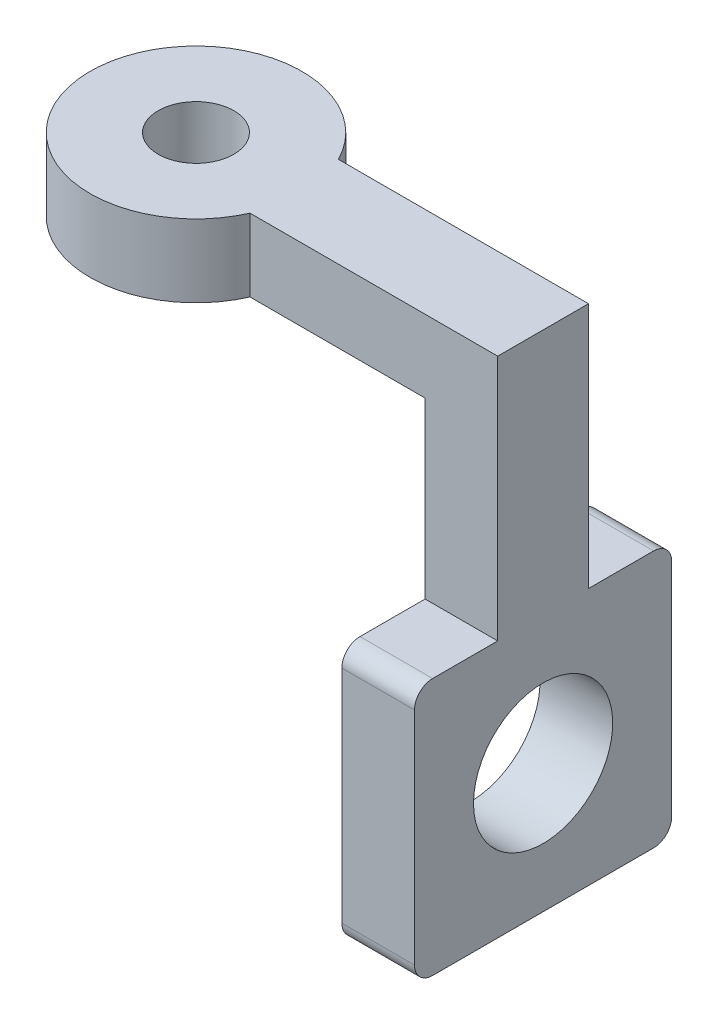
ISO-10303-21;
HEADER;
FILE_DESCRIPTION(('STEP AP214'),'2;1');
FILE_NAME('part.step','',(''),(''),'','','');
FILE_SCHEMA(('AUTOMOTIVE_DESIGN { 1 0 10303 214 1 1 1 1 }'));
ENDSEC;
DATA;
#1=APPLICATION_CONTEXT('core data for automotive mechanical design processes');
#2=APPLICATION_PROTOCOL_DEFINITION('international standard','automotive_design',2000,#1);
#3=PRODUCT_CONTEXT('',#1,'mechanical');
#4=PRODUCT('Part','Part','',(#3));
#5=PRODUCT_RELATED_PRODUCT_CATEGORY('part','',(#4));
#6=PRODUCT_DEFINITION_FORMATION('','',#4);
#7=PRODUCT_DEFINITION_CONTEXT('part definition',#1,'design');
#8=PRODUCT_DEFINITION('design','',#6,#7);
#9=PRODUCT_DEFINITION_SHAPE('','',#8);
#10=(LENGTH_UNIT() NAMED_UNIT(*) SI_UNIT(.MILLI.,.METRE.));
#11=(NAMED_UNIT(*) PLANE_ANGLE_UNIT() SI_UNIT($,.RADIAN.));
#12=(NAMED_UNIT(*) SI_UNIT($,.STERADIAN.) SOLID_ANGLE_UNIT());
#13=UNCERTAINTY_MEASURE_WITH_UNIT(LENGTH_MEASURE(1.E-05),#10,'distance_accuracy_value','');
#14=(GEOMETRIC_REPRESENTATION_CONTEXT(3) GLOBAL_UNCERTAINTY_ASSIGNED_CONTEXT((#13)) GLOBAL_UNIT_ASSIGNED_CONTEXT((#10,
#11,#12)) REPRESENTATION_CONTEXT('',''));
#15=CARTESIAN_POINT('',(0.,0.,0.));
#16=DIRECTION('',(0.,0.,1.));
#17=DIRECTION('',(1.,0.,0.));
#18=AXIS2_PLACEMENT_3D('',#15,#16,#17);
#19=CARTESIAN_POINT('',(-1.15344042768471,49.9375,15.));
#20=DIRECTION('',(0.,0.,1.));
#21=DIRECTION('',(1.,0.,0.));
#22=AXIS2_PLACEMENT_3D('',#19,#20,#21);
#23=PLANE('',#22);
#24=DIRECTION('',(0.,1.,0.));
#25=VECTOR('',#24,1.);
#26=CARTESIAN_POINT('',(-13.1534404276847,-33.3125,15.));
#27=LINE('',#26,#25);
#28=CARTESIAN_POINT('',(-13.1534404276847,9.1875,15.));
#29=VERTEX_POINT('',#28);
#30=CARTESIAN_POINT('',(-13.1534404276847,37.9375,15.));
#31=VERTEX_POINT('',#30);
#32=EDGE_CURVE('E151',#29,#31,#27,.T.);
#33=ORIENTED_EDGE('',*,*,#32,.F.);
#34=DIRECTION('',(-1.,0.,0.));
#35=VECTOR('',#34,1.);
#36=CARTESIAN_POINT('',(-13.1534404276847,9.1875,15.));
#37=LINE('',#36,#35);
#38=CARTESIAN_POINT('',(-1.1534404276847,9.1875,15.));
#39=VERTEX_POINT('',#38);
#40=EDGE_CURVE('E137',#39,#29,#37,.T.);
#41=ORIENTED_EDGE('',*,*,#40,.F.);
#42=DIRECTION('',(0.,-1.,0.));
#43=VECTOR('',#42,1.);
#44=CARTESIAN_POINT('',(-1.15344042768471,49.9375,15.));
#45=LINE('',#44,#43);
#46=CARTESIAN_POINT('',(-1.15344042768471,49.9375,15.));
#47=VERTEX_POINT('',#46);
#48=EDGE_CURVE('E148',#47,#39,#45,.T.);
#49=ORIENTED_EDGE('',*,*,#48,.F.);
#50=DIRECTION('',(-1.,0.,0.));
#51=VECTOR('',#50,1.);
#52=CARTESIAN_POINT('',(-1.15344042768471,49.9375,15.));
#53=LINE('',#52,#51);
#54=CARTESIAN_POINT('',(-42.0763383088604,49.9375,15.));
#55=VERTEX_POINT('',#54);
#56=EDGE_CURVE('E248',#47,#55,#53,.T.);
#57=ORIENTED_EDGE('',*,*,#56,.T.);
#58=DIRECTION('',(0.,-1.,0.));
#59=VECTOR('',#58,1.);
#60=CARTESIAN_POINT('',(-42.0763383088604,49.9375,15.));
#61=LINE('',#60,#59);
#62=CARTESIAN_POINT('',(-42.0763383088604,37.9375,15.));
#63=VERTEX_POINT('',#62);
#64=EDGE_CURVE('E159',#55,#63,#61,.T.);
#65=ORIENTED_EDGE('',*,*,#64,.T.);
#66=DIRECTION('',(-1.,0.,0.));
#67=VECTOR('',#66,1.);
#68=CARTESIAN_POINT('',(-1.15344042768471,37.9375,15.));
#69=LINE('',#68,#67);
#70=EDGE_CURVE('E246',#31,#63,#69,.T.);
#71=ORIENTED_EDGE('',*,*,#70,.F.);
#72=EDGE_LOOP('',(#33,#41,#49,#57,#65,#71));
#73=FACE_BOUND('',#72,.T.);
#74=ADVANCED_FACE('F33',(#73),#23,.T.);
#75=CARTESIAN_POINT('',(-42.4752725396709,49.9375,0.));
#76=DIRECTION('',(0.,0.,-1.));
#77=DIRECTION('',(-1.,0.,0.));
#78=AXIS2_PLACEMENT_3D('',#75,#76,#77);
#79=PLANE('',#78);
#80=DIRECTION('',(0.,-1.,0.));
#81=VECTOR('',#80,1.);
#82=CARTESIAN_POINT('',(-1.15344042768471,49.9375,0.));
#83=LINE('',#82,#81);
#84=CARTESIAN_POINT('',(-1.15344042768471,49.9375,0.));
#85=VERTEX_POINT('',#84);
#86=CARTESIAN_POINT('',(-1.1534404276847,9.1875,0.));
#87=VERTEX_POINT('',#86);
#88=EDGE_CURVE('E179',#85,#87,#83,.T.);
#89=ORIENTED_EDGE('',*,*,#88,.T.);
#90=DIRECTION('',(1.,0.,0.));
#91=VECTOR('',#90,1.);
#92=CARTESIAN_POINT('',(-1.1534404276847,9.1875,0.));
#93=LINE('',#92,#91);
#94=CARTESIAN_POINT('',(-13.1534404276847,9.1875,0.));
#95=VERTEX_POINT('',#94);
#96=EDGE_CURVE('E143',#95,#87,#93,.T.);
#97=ORIENTED_EDGE('',*,*,#96,.F.);
#98=DIRECTION('',(0.,1.,0.));
#99=VECTOR('',#98,1.);
#100=CARTESIAN_POINT('',(-13.1534404276847,-33.3125,0.));
#101=LINE('',#100,#99);
#102=CARTESIAN_POINT('',(-13.1534404276847,37.9375,0.));
#103=VERTEX_POINT('',#102);
#104=EDGE_CURVE('E241',#95,#103,#101,.T.);
#105=ORIENTED_EDGE('',*,*,#104,.T.);
#106=DIRECTION('',(1.,0.,0.));
#107=VECTOR('',#106,1.);
#108=CARTESIAN_POINT('',(-42.4752725396709,37.9375,0.));
#109=LINE('',#108,#107);
#110=CARTESIAN_POINT('',(-42.4752725396708,37.9375,0.));
#111=VERTEX_POINT('',#110);
#112=EDGE_CURVE('E249',#111,#103,#109,.T.);
#113=ORIENTED_EDGE('',*,*,#112,.F.);
#114=DIRECTION('',(0.,-1.,0.));
#115=VECTOR('',#114,1.);
#116=CARTESIAN_POINT('',(-42.4752725396708,49.9375,0.));
#117=LINE('',#116,#115);
#118=CARTESIAN_POINT('',(-42.4752725396708,49.9375,0.));
#119=VERTEX_POINT('',#118);
#120=EDGE_CURVE('E163',#119,#111,#117,.T.);
#121=ORIENTED_EDGE('',*,*,#120,.F.);
#122=DIRECTION('',(1.,0.,0.));
#123=VECTOR('',#122,1.);
#124=CARTESIAN_POINT('',(-42.4752725396709,49.9375,0.));
#125=LINE('',#124,#123);
#126=EDGE_CURVE('E160',#119,#85,#125,.T.);
#127=ORIENTED_EDGE('',*,*,#126,.T.);
#128=EDGE_LOOP('',(#89,#97,#105,#113,#121,#127));
#129=FACE_BOUND('',#128,.T.);
#130=ADVANCED_FACE('F270',(#129),#79,.T.);
#131=CARTESIAN_POINT('',(-1.15344042768471,49.9375,0.));
#132=DIRECTION('',(1.,0.,0.));
#133=DIRECTION('',(0.,0.,-1.));
#134=AXIS2_PLACEMENT_3D('',#131,#132,#133);
#135=PLANE('',#134);
#136=CARTESIAN_POINT('',(-1.15344042768469,-12.0625,7.5));
#137=DIRECTION('',(-1.,0.,0.));
#138=DIRECTION('',(0.,0.,1.));
#139=AXIS2_PLACEMENT_3D('',#136,#137,#138);
#140=CIRCLE('',#139,11.5);
#141=CARTESIAN_POINT('',(-1.15344042768469,-12.0625,19.));
#142=VERTEX_POINT('',#141);
#143=EDGE_CURVE('E153',#142,#142,#140,.T.);
#144=ORIENTED_EDGE('',*,*,#143,.T.);
#145=EDGE_LOOP('',(#144));
#146=FACE_BOUND('',#145,.T.);
#147=DIRECTION('',(0.,0.,-1.));
#148=VECTOR('',#147,1.);
#149=CARTESIAN_POINT('',(-1.1534404276847,9.1875,28.75));
#150=LINE('',#149,#148);
#151=CARTESIAN_POINT('',(-1.1534404276847,9.1875,25.75));
#152=VERTEX_POINT('',#151);
#153=EDGE_CURVE('E133',#152,#39,#150,.T.);
#154=ORIENTED_EDGE('',*,*,#153,.F.);
#155=CARTESIAN_POINT('',(-1.15344042768471,6.1875,25.75));
#156=DIRECTION('',(1.,0.,0.));
#157=DIRECTION('',(0.,0.,-1.));
#158=AXIS2_PLACEMENT_3D('',#155,#156,#157);
#159=CIRCLE('',#158,3.);
#160=CARTESIAN_POINT('',(-1.1534404276847,6.1875,28.75));
#161=VERTEX_POINT('',#160);
#162=EDGE_CURVE('E195',#152,#161,#159,.T.);
#163=ORIENTED_EDGE('',*,*,#162,.T.);
#164=DIRECTION('',(0.,1.,0.));
#165=VECTOR('',#164,1.);
#166=CARTESIAN_POINT('',(-1.1534404276847,9.1875,28.75));
#167=LINE('',#166,#165);
#168=CARTESIAN_POINT('',(-1.1534404276847,-30.3125,28.75));
#169=VERTEX_POINT('',#168);
#170=EDGE_CURVE('E152',#169,#161,#167,.T.);
#171=ORIENTED_EDGE('',*,*,#170,.F.);
#172=CARTESIAN_POINT('',(-1.15344042768471,-30.3125,25.75));
#173=DIRECTION('',(1.,0.,0.));
#174=DIRECTION('',(0.,0.,-1.));
#175=AXIS2_PLACEMENT_3D('',#172,#173,#174);
#176=CIRCLE('',#175,3.);
#177=CARTESIAN_POINT('',(-1.15344042768471,-33.3125,25.75));
#178=VERTEX_POINT('',#177);
#179=EDGE_CURVE('E192',#169,#178,#176,.T.);
#180=ORIENTED_EDGE('',*,*,#179,.T.);
#181=DIRECTION('',(0.,0.,1.));
#182=VECTOR('',#181,1.);
#183=CARTESIAN_POINT('',(-1.15344042768471,-33.3125,15.));
#184=LINE('',#183,#182);
#185=CARTESIAN_POINT('',(-1.15344042768471,-33.3125,-10.75));
#186=VERTEX_POINT('',#185);
#187=EDGE_CURVE('E209',#186,#178,#184,.T.);
#188=ORIENTED_EDGE('',*,*,#187,.F.);
#189=CARTESIAN_POINT('',(-1.15344042768471,-30.3125,-10.75));
#190=DIRECTION('',(1.,0.,0.));
#191=DIRECTION('',(0.,0.,-1.));
#192=AXIS2_PLACEMENT_3D('',#189,#190,#191);
#193=CIRCLE('',#192,3.);
#194=CARTESIAN_POINT('',(-1.15344042768469,-30.3125,-13.75));
#195=VERTEX_POINT('',#194);
#196=EDGE_CURVE('E54',#186,#195,#193,.T.);
#197=ORIENTED_EDGE('',*,*,#196,.T.);
#198=DIRECTION('',(0.,-1.,0.));
#199=VECTOR('',#198,1.);
#200=CARTESIAN_POINT('',(-1.15344042768469,-33.3125,-13.75));
#201=LINE('',#200,#199);
#202=CARTESIAN_POINT('',(-1.1534404276847,6.18750000000001,-13.75));
#203=VERTEX_POINT('',#202);
#204=EDGE_CURVE('E224',#203,#195,#201,.T.);
#205=ORIENTED_EDGE('',*,*,#204,.F.);
#206=CARTESIAN_POINT('',(-1.15344042768471,6.1875,-10.75));
#207=DIRECTION('',(1.,0.,0.));
#208=DIRECTION('',(0.,0.,-1.));
#209=AXIS2_PLACEMENT_3D('',#206,#207,#208);
#210=CIRCLE('',#209,3.);
#211=CARTESIAN_POINT('',(-1.1534404276847,9.1875,-10.75));
#212=VERTEX_POINT('',#211);
#213=EDGE_CURVE('E48',#203,#212,#210,.T.);
#214=ORIENTED_EDGE('',*,*,#213,.T.);
#215=DIRECTION('',(0.,0.,1.));
#216=VECTOR('',#215,1.);
#217=CARTESIAN_POINT('',(-1.1534404276847,9.1875,-13.75));
#218=LINE('',#217,#216);
#219=EDGE_CURVE('E231',#212,#87,#218,.T.);
#220=ORIENTED_EDGE('',*,*,#219,.T.);
#221=ORIENTED_EDGE('',*,*,#88,.F.);
#222=DIRECTION('',(0.,0.,1.));
#223=VECTOR('',#222,1.);
#224=CARTESIAN_POINT('',(-1.15344042768471,49.9375,0.));
#225=LINE('',#224,#223);
#226=EDGE_CURVE('E158',#85,#47,#225,.T.);
#227=ORIENTED_EDGE('',*,*,#226,.T.);
#228=ORIENTED_EDGE('',*,*,#48,.T.);
#229=EDGE_LOOP('',(#154,#163,#171,#180,#188,#197,#205,#214,#220,#221,#227,#228));
#230=FACE_BOUND('',#229,.T.);
#231=ADVANCED_FACE('F156',(#146,#230),#135,.T.);
#232=CARTESIAN_POINT('',(-58.0803469959912,49.9375,7.9203315090152));
#233=DIRECTION('',(0.,-1.,0.));
#234=DIRECTION('',(0.,0.,-1.));
#235=AXIS2_PLACEMENT_3D('',#232,#233,#234);
#236=CYLINDRICAL_SURFACE('',#235,17.5);
#237=CARTESIAN_POINT('',(-58.0803469959912,37.9375,7.9203315090152));
#238=DIRECTION('',(0.,-1.,0.));
#239=DIRECTION('',(0.,0.,-1.));
#240=AXIS2_PLACEMENT_3D('',#237,#238,#239);
#241=CIRCLE('',#240,17.5);
#242=EDGE_CURVE('E254',#63,#111,#241,.T.);
#243=ORIENTED_EDGE('',*,*,#242,.F.);
#244=ORIENTED_EDGE('',*,*,#64,.F.);
#245=CARTESIAN_POINT('',(-58.0803469959912,49.9375,7.9203315090152));
#246=DIRECTION('',(0.,-1.,0.));
#247=DIRECTION('',(0.,0.,-1.));
#248=AXIS2_PLACEMENT_3D('',#245,#246,#247);
#249=CIRCLE('',#248,17.5);
#250=EDGE_CURVE('E166',#55,#119,#249,.T.);
#251=ORIENTED_EDGE('',*,*,#250,.T.);
#252=ORIENTED_EDGE('',*,*,#120,.T.);
#253=EDGE_LOOP('',(#243,#244,#251,#252));
#254=FACE_BOUND('',#253,.T.);
#255=ADVANCED_FACE('F262',(#254),#236,.T.);
#256=CARTESIAN_POINT('',(-58.0803469959912,49.9375,7.9203315090152));
#257=DIRECTION('',(0.,-1.,0.));
#258=DIRECTION('',(0.,0.,-1.));
#259=AXIS2_PLACEMENT_3D('',#256,#257,#258);
#260=PLANE('',#259);
#261=CARTESIAN_POINT('',(-58.0803469959912,49.9375,7.9203315090152));
#262=DIRECTION('',(0.,1.,0.));
#263=DIRECTION('',(0.,0.,1.));
#264=AXIS2_PLACEMENT_3D('',#261,#262,#263);
#265=CIRCLE('',#264,6.24999999999998);
#266=CARTESIAN_POINT('',(-58.0803469959912,49.9375,14.1703315090152));
#267=VERTEX_POINT('',#266);
#268=EDGE_CURVE('E174',#267,#267,#265,.T.);
#269=ORIENTED_EDGE('',*,*,#268,.F.);
#270=EDGE_LOOP('',(#269));
#271=FACE_BOUND('',#270,.T.);
#272=ORIENTED_EDGE('',*,*,#226,.F.);
#273=ORIENTED_EDGE('',*,*,#126,.F.);
#274=ORIENTED_EDGE('',*,*,#250,.F.);
#275=ORIENTED_EDGE('',*,*,#56,.F.);
#276=EDGE_LOOP('',(#272,#273,#274,#275));
#277=FACE_BOUND('',#276,.T.);
#278=ADVANCED_FACE('F274',(#271,#277),#260,.F.);
#279=CARTESIAN_POINT('',(-58.0803469959912,37.9375,7.9203315090152));
#280=DIRECTION('',(0.,-1.,0.));
#281=DIRECTION('',(0.,0.,-1.));
#282=AXIS2_PLACEMENT_3D('',#279,#280,#281);
#283=PLANE('',#282);
#284=CARTESIAN_POINT('',(-58.0803469959912,37.9375,7.9203315090152));
#285=DIRECTION('',(0.,-1.,0.));
#286=DIRECTION('',(0.,0.,-1.));
#287=AXIS2_PLACEMENT_3D('',#284,#285,#286);
#288=CIRCLE('',#287,6.24999999999998);
#289=CARTESIAN_POINT('',(-58.0803469959912,37.9375,1.67033150901522));
#290=VERTEX_POINT('',#289);
#291=EDGE_CURVE('E170',#290,#290,#288,.T.);
#292=ORIENTED_EDGE('',*,*,#291,.F.);
#293=EDGE_LOOP('',(#292));
#294=FACE_BOUND('',#293,.T.);
#295=DIRECTION('',(0.,0.,-1.));
#296=VECTOR('',#295,1.);
#297=CARTESIAN_POINT('',(-13.1534404276847,37.9375,0.));
#298=LINE('',#297,#296);
#299=EDGE_CURVE('E215',#31,#103,#298,.T.);
#300=ORIENTED_EDGE('',*,*,#299,.F.);
#301=ORIENTED_EDGE('',*,*,#70,.T.);
#302=ORIENTED_EDGE('',*,*,#242,.T.);
#303=ORIENTED_EDGE('',*,*,#112,.T.);
#304=EDGE_LOOP('',(#300,#301,#302,#303));
#305=FACE_BOUND('',#304,.T.);
#306=ADVANCED_FACE('F269',(#294,#305),#283,.T.);
#307=CARTESIAN_POINT('',(-13.1534404276847,-33.3125,0.));
#308=DIRECTION('',(1.,0.,0.));
#309=DIRECTION('',(0.,0.,-1.));
#310=AXIS2_PLACEMENT_3D('',#307,#308,#309);
#311=PLANE('',#310);
#312=CARTESIAN_POINT('',(-13.1534404276847,-12.0625,7.5));
#313=DIRECTION('',(-1.,0.,0.));
#314=DIRECTION('',(0.,0.,1.));
#315=AXIS2_PLACEMENT_3D('',#312,#313,#314);
#316=CIRCLE('',#315,11.5);
#317=CARTESIAN_POINT('',(-13.1534404276847,-12.0625,19.));
#318=VERTEX_POINT('',#317);
#319=EDGE_CURVE('E173',#318,#318,#316,.T.);
#320=ORIENTED_EDGE('',*,*,#319,.F.);
#321=EDGE_LOOP('',(#320));
#322=FACE_BOUND('',#321,.T.);
#323=DIRECTION('',(0.,-1.,0.));
#324=VECTOR('',#323,1.);
#325=CARTESIAN_POINT('',(-13.1534404276847,-33.3125,28.75));
#326=LINE('',#325,#324);
#327=CARTESIAN_POINT('',(-13.1534404276847,6.1875,28.75));
#328=VERTEX_POINT('',#327);
#329=CARTESIAN_POINT('',(-13.1534404276847,-30.3125,28.75));
#330=VERTEX_POINT('',#329);
#331=EDGE_CURVE('E315',#328,#330,#326,.T.);
#332=ORIENTED_EDGE('',*,*,#331,.F.);
#333=CARTESIAN_POINT('',(-13.1534404276847,6.1875,25.75));
#334=DIRECTION('',(1.,0.,0.));
#335=DIRECTION('',(0.,0.,-1.));
#336=AXIS2_PLACEMENT_3D('',#333,#334,#335);
#337=CIRCLE('',#336,3.);
#338=CARTESIAN_POINT('',(-13.1534404276847,9.1875,25.75));
#339=VERTEX_POINT('',#338);
#340=EDGE_CURVE('E188',#328,#339,#337,.F.);
#341=ORIENTED_EDGE('',*,*,#340,.T.);
#342=DIRECTION('',(0.,0.,-1.));
#343=VECTOR('',#342,1.);
#344=CARTESIAN_POINT('',(-13.1534404276847,9.1875,28.75));
#345=LINE('',#344,#343);
#346=EDGE_CURVE('E144',#339,#29,#345,.T.);
#347=ORIENTED_EDGE('',*,*,#346,.T.);
#348=ORIENTED_EDGE('',*,*,#32,.T.);
#349=ORIENTED_EDGE('',*,*,#299,.T.);
#350=ORIENTED_EDGE('',*,*,#104,.F.);
#351=DIRECTION('',(0.,0.,1.));
#352=VECTOR('',#351,1.);
#353=CARTESIAN_POINT('',(-13.1534404276847,9.1875,-13.75));
#354=LINE('',#353,#352);
#355=CARTESIAN_POINT('',(-13.1534404276847,9.1875,-10.75));
#356=VERTEX_POINT('',#355);
#357=EDGE_CURVE('E238',#356,#95,#354,.T.);
#358=ORIENTED_EDGE('',*,*,#357,.F.);
#359=CARTESIAN_POINT('',(-13.1534404276847,6.1875,-10.75));
#360=DIRECTION('',(1.,0.,0.));
#361=DIRECTION('',(0.,0.,-1.));
#362=AXIS2_PLACEMENT_3D('',#359,#360,#361);
#363=CIRCLE('',#362,3.);
#364=CARTESIAN_POINT('',(-13.1534404276847,6.1875,-13.75));
#365=VERTEX_POINT('',#364);
#366=EDGE_CURVE('E186',#356,#365,#363,.F.);
#367=ORIENTED_EDGE('',*,*,#366,.T.);
#368=DIRECTION('',(0.,1.,0.));
#369=VECTOR('',#368,1.);
#370=CARTESIAN_POINT('',(-13.1534404276847,9.1875,-13.75));
#371=LINE('',#370,#369);
#372=CARTESIAN_POINT('',(-13.1534404276847,-30.3125,-13.75));
#373=VERTEX_POINT('',#372);
#374=EDGE_CURVE('E222',#373,#365,#371,.T.);
#375=ORIENTED_EDGE('',*,*,#374,.F.);
#376=CARTESIAN_POINT('',(-13.1534404276847,-30.3125,-10.75));
#377=DIRECTION('',(1.,0.,0.));
#378=DIRECTION('',(0.,0.,-1.));
#379=AXIS2_PLACEMENT_3D('',#376,#377,#378);
#380=CIRCLE('',#379,3.);
#381=CARTESIAN_POINT('',(-13.1534404276847,-33.3125,-10.75));
#382=VERTEX_POINT('',#381);
#383=EDGE_CURVE('E182',#373,#382,#380,.F.);
#384=ORIENTED_EDGE('',*,*,#383,.T.);
#385=DIRECTION('',(0.,0.,-1.));
#386=VECTOR('',#385,1.);
#387=CARTESIAN_POINT('',(-13.1534404276847,-33.3125,0.));
#388=LINE('',#387,#386);
#389=CARTESIAN_POINT('',(-13.1534404276847,-33.3125,25.75));
#390=VERTEX_POINT('',#389);
#391=EDGE_CURVE('E212',#390,#382,#388,.T.);
#392=ORIENTED_EDGE('',*,*,#391,.F.);
#393=CARTESIAN_POINT('',(-13.1534404276847,-30.3125,25.75));
#394=DIRECTION('',(1.,0.,0.));
#395=DIRECTION('',(0.,0.,-1.));
#396=AXIS2_PLACEMENT_3D('',#393,#394,#395);
#397=CIRCLE('',#396,3.);
#398=EDGE_CURVE('E184',#390,#330,#397,.F.);
#399=ORIENTED_EDGE('',*,*,#398,.T.);
#400=EDGE_LOOP('',(#332,#341,#347,#348,#349,#350,#358,#367,#375,#384,#392,#399));
#401=FACE_BOUND('',#400,.T.);
#402=ADVANCED_FACE('F227',(#322,#401),#311,.F.);
#403=CARTESIAN_POINT('',(0.,-33.3125,0.));
#404=DIRECTION('',(0.,1.,0.));
#405=DIRECTION('',(0.,0.,1.));
#406=AXIS2_PLACEMENT_3D('',#403,#404,#405);
#407=PLANE('',#406);
#408=ORIENTED_EDGE('',*,*,#187,.T.);
#409=DIRECTION('',(1.,0.,0.));
#410=VECTOR('',#409,1.);
#411=CARTESIAN_POINT('',(0.,-33.3125,25.75));
#412=LINE('',#411,#410);
#413=EDGE_CURVE('E11',#178,#390,#412,.F.);
#414=ORIENTED_EDGE('',*,*,#413,.T.);
#415=ORIENTED_EDGE('',*,*,#391,.T.);
#416=DIRECTION('',(-1.,0.,0.));
#417=VECTOR('',#416,1.);
#418=CARTESIAN_POINT('',(0.,-33.3125,-10.75));
#419=LINE('',#418,#417);
#420=EDGE_CURVE('E41',#382,#186,#419,.F.);
#421=ORIENTED_EDGE('',*,*,#420,.T.);
#422=EDGE_LOOP('',(#408,#414,#415,#421));
#423=FACE_BOUND('',#422,.T.);
#424=ADVANCED_FACE('F208',(#423),#407,.F.);
#425=CARTESIAN_POINT('',(-1.1534404276847,9.1875,-13.75));
#426=DIRECTION('',(0.,-1.,0.));
#427=DIRECTION('',(1.,0.,0.));
#428=AXIS2_PLACEMENT_3D('',#425,#426,#427);
#429=PLANE('',#428);
#430=ORIENTED_EDGE('',*,*,#219,.F.);
#431=DIRECTION('',(1.,0.,0.));
#432=VECTOR('',#431,1.);
#433=CARTESIAN_POINT('',(-1.1534404276847,9.1875,-10.75));
#434=LINE('',#433,#432);
#435=EDGE_CURVE('E203',#212,#356,#434,.F.);
#436=ORIENTED_EDGE('',*,*,#435,.T.);
#437=ORIENTED_EDGE('',*,*,#357,.T.);
#438=ORIENTED_EDGE('',*,*,#96,.T.);
#439=EDGE_LOOP('',(#430,#436,#437,#438));
#440=FACE_BOUND('',#439,.T.);
#441=ADVANCED_FACE('F277',(#440),#429,.F.);
#442=CARTESIAN_POINT('',(0.,0.,-13.75));
#443=DIRECTION('',(0.,0.,1.));
#444=DIRECTION('',(1.,0.,0.));
#445=AXIS2_PLACEMENT_3D('',#442,#443,#444);
#446=PLANE('',#445);
#447=ORIENTED_EDGE('',*,*,#374,.T.);
#448=DIRECTION('',(1.,0.,0.));
#449=VECTOR('',#448,1.);
#450=CARTESIAN_POINT('',(0.,6.1875,-13.75));
#451=LINE('',#450,#449);
#452=EDGE_CURVE('E200',#365,#203,#451,.T.);
#453=ORIENTED_EDGE('',*,*,#452,.T.);
#454=ORIENTED_EDGE('',*,*,#204,.T.);
#455=DIRECTION('',(-1.,0.,0.));
#456=VECTOR('',#455,1.);
#457=CARTESIAN_POINT('',(0.,-30.3125,-13.75));
#458=LINE('',#457,#456);
#459=EDGE_CURVE('E197',#195,#373,#458,.T.);
#460=ORIENTED_EDGE('',*,*,#459,.T.);
#461=EDGE_LOOP('',(#447,#453,#454,#460));
#462=FACE_BOUND('',#461,.T.);
#463=ADVANCED_FACE('F221',(#462),#446,.F.);
#464=CARTESIAN_POINT('',(-13.1534404276847,9.1875,28.75));
#465=DIRECTION('',(0.,-1.,0.));
#466=DIRECTION('',(0.,0.,-1.));
#467=AXIS2_PLACEMENT_3D('',#464,#465,#466);
#468=PLANE('',#467);
#469=ORIENTED_EDGE('',*,*,#346,.F.);
#470=DIRECTION('',(-1.,0.,0.));
#471=VECTOR('',#470,1.);
#472=CARTESIAN_POINT('',(-13.1534404276847,9.1875,25.75));
#473=LINE('',#472,#471);
#474=EDGE_CURVE('E140',#339,#152,#473,.F.);
#475=ORIENTED_EDGE('',*,*,#474,.T.);
#476=ORIENTED_EDGE('',*,*,#153,.T.);
#477=ORIENTED_EDGE('',*,*,#40,.T.);
#478=EDGE_LOOP('',(#469,#475,#476,#477));
#479=FACE_BOUND('',#478,.T.);
#480=ADVANCED_FACE('F136',(#479),#468,.F.);
#481=CARTESIAN_POINT('',(0.,0.,28.75));
#482=DIRECTION('',(0.,0.,-1.));
#483=DIRECTION('',(-1.,0.,0.));
#484=AXIS2_PLACEMENT_3D('',#481,#482,#483);
#485=PLANE('',#484);
#486=ORIENTED_EDGE('',*,*,#170,.T.);
#487=DIRECTION('',(-1.,0.,0.));
#488=VECTOR('',#487,1.);
#489=CARTESIAN_POINT('',(0.,6.1875,28.75));
#490=LINE('',#489,#488);
#491=EDGE_CURVE('E178',#161,#328,#490,.T.);
#492=ORIENTED_EDGE('',*,*,#491,.T.);
#493=ORIENTED_EDGE('',*,*,#331,.T.);
#494=DIRECTION('',(1.,0.,0.));
#495=VECTOR('',#494,1.);
#496=CARTESIAN_POINT('',(0.,-30.3125,28.75));
#497=LINE('',#496,#495);
#498=EDGE_CURVE('E175',#330,#169,#497,.T.);
#499=ORIENTED_EDGE('',*,*,#498,.T.);
#500=EDGE_LOOP('',(#486,#492,#493,#499));
#501=FACE_BOUND('',#500,.T.);
#502=ADVANCED_FACE('F319',(#501),#485,.F.);
#503=CARTESIAN_POINT('',(-13.1534404276847,-12.0625,7.5));
#504=DIRECTION('',(-1.,0.,0.));
#505=DIRECTION('',(0.,0.,1.));
#506=AXIS2_PLACEMENT_3D('',#503,#504,#505);
#507=CYLINDRICAL_SURFACE('',#506,11.5);
#508=ORIENTED_EDGE('',*,*,#143,.F.);
#509=EDGE_LOOP('',(#508));
#510=FACE_BOUND('',#509,.T.);
#511=ORIENTED_EDGE('',*,*,#319,.T.);
#512=EDGE_LOOP('',(#511));
#513=FACE_BOUND('',#512,.T.);
#514=ADVANCED_FACE('F323',(#510,#513),#507,.F.);
#515=CARTESIAN_POINT('',(-58.0803469959912,49.9375,7.9203315090152));
#516=DIRECTION('',(0.,1.,0.));
#517=DIRECTION('',(0.,0.,1.));
#518=AXIS2_PLACEMENT_3D('',#515,#516,#517);
#519=CYLINDRICAL_SURFACE('',#518,6.24999999999998);
#520=ORIENTED_EDGE('',*,*,#291,.T.);
#521=EDGE_LOOP('',(#520));
#522=FACE_BOUND('',#521,.T.);
#523=ORIENTED_EDGE('',*,*,#268,.T.);
#524=EDGE_LOOP('',(#523));
#525=FACE_BOUND('',#524,.T.);
#526=ADVANCED_FACE('F289',(#522,#525),#519,.F.);
#527=CARTESIAN_POINT('',(0.,6.1875,25.75));
#528=DIRECTION('',(-1.,0.,0.));
#529=DIRECTION('',(0.,0.,1.));
#530=AXIS2_PLACEMENT_3D('',#527,#528,#529);
#531=CYLINDRICAL_SURFACE('',#530,3.);
#532=ORIENTED_EDGE('',*,*,#162,.F.);
#533=ORIENTED_EDGE('',*,*,#474,.F.);
#534=ORIENTED_EDGE('',*,*,#340,.F.);
#535=ORIENTED_EDGE('',*,*,#491,.F.);
#536=EDGE_LOOP('',(#532,#533,#534,#535));
#537=FACE_BOUND('',#536,.T.);
#538=ADVANCED_FACE('F282',(#537),#531,.T.);
#539=CARTESIAN_POINT('',(0.,6.1875,-10.75));
#540=DIRECTION('',(1.,0.,0.));
#541=DIRECTION('',(0.,1.,0.));
#542=AXIS2_PLACEMENT_3D('',#539,#540,#541);
#543=CYLINDRICAL_SURFACE('',#542,3.);
#544=ORIENTED_EDGE('',*,*,#366,.F.);
#545=ORIENTED_EDGE('',*,*,#435,.F.);
#546=ORIENTED_EDGE('',*,*,#213,.F.);
#547=ORIENTED_EDGE('',*,*,#452,.F.);
#548=EDGE_LOOP('',(#544,#545,#546,#547));
#549=FACE_BOUND('',#548,.T.);
#550=ADVANCED_FACE('F279',(#549),#543,.T.);
#551=CARTESIAN_POINT('',(0.,-30.3125,25.75));
#552=DIRECTION('',(1.,0.,0.));
#553=DIRECTION('',(0.,0.,-1.));
#554=AXIS2_PLACEMENT_3D('',#551,#552,#553);
#555=CYLINDRICAL_SURFACE('',#554,3.);
#556=ORIENTED_EDGE('',*,*,#398,.F.);
#557=ORIENTED_EDGE('',*,*,#413,.F.);
#558=ORIENTED_EDGE('',*,*,#179,.F.);
#559=ORIENTED_EDGE('',*,*,#498,.F.);
#560=EDGE_LOOP('',(#556,#557,#558,#559));
#561=FACE_BOUND('',#560,.T.);
#562=ADVANCED_FACE('F281',(#561),#555,.T.);
#563=CARTESIAN_POINT('',(0.,-30.3125,-10.75));
#564=DIRECTION('',(-1.,0.,0.));
#565=DIRECTION('',(0.,0.,1.));
#566=AXIS2_PLACEMENT_3D('',#563,#564,#565);
#567=CYLINDRICAL_SURFACE('',#566,3.);
#568=ORIENTED_EDGE('',*,*,#196,.F.);
#569=ORIENTED_EDGE('',*,*,#420,.F.);
#570=ORIENTED_EDGE('',*,*,#383,.F.);
#571=ORIENTED_EDGE('',*,*,#459,.F.);
#572=EDGE_LOOP('',(#568,#569,#570,#571));
#573=FACE_BOUND('',#572,.T.);
#574=ADVANCED_FACE('F35',(#573),#567,.T.);
#575=CLOSED_SHELL('',(#74,#130,#231,#255,#278,#306,#402,#424,#441,#463,#480,#502,#514,#526,#538,
#550,#562,#574));
#576=MANIFOLD_SOLID_BREP('B2',#575);
#577=ADVANCED_BREP_SHAPE_REPRESENTATION('',(#18,#576),#14);
#578=SHAPE_DEFINITION_REPRESENTATION(#9,#577);
ENDSEC;
END-ISO-10303-21;
